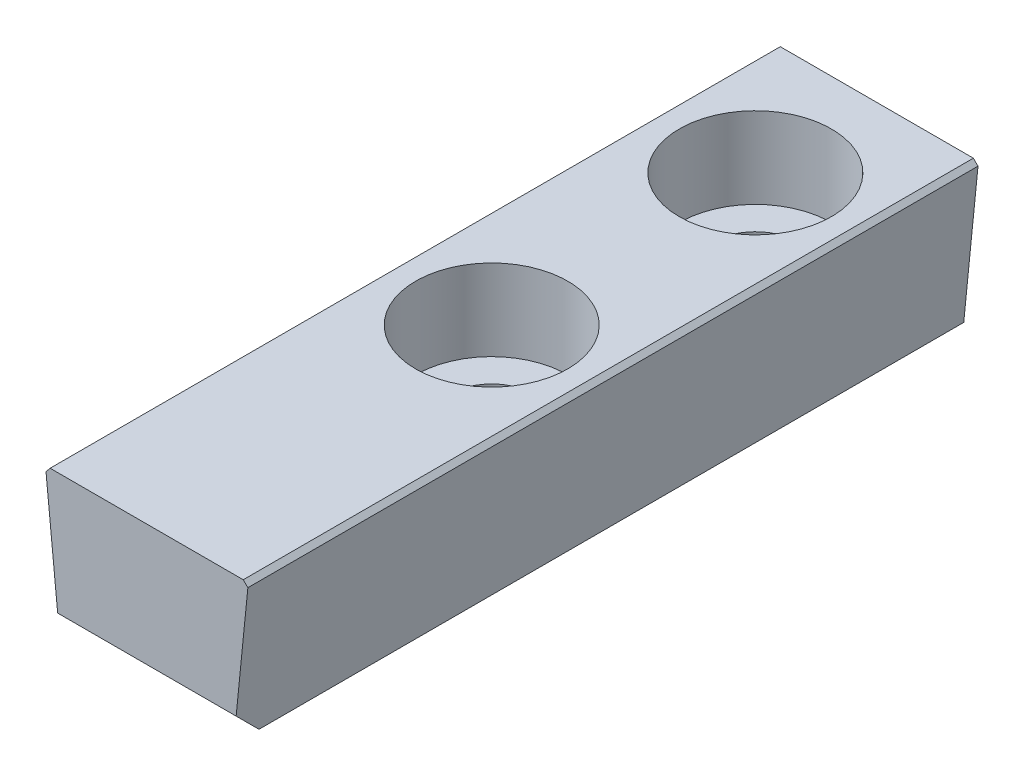
ISO-10303-21;
HEADER;
FILE_DESCRIPTION(('STEP AP214'),'2;1');
FILE_NAME('part.step','',(''),(''),'','','');
FILE_SCHEMA(('AUTOMOTIVE_DESIGN { 1 0 10303 214 1 1 1 1 }'));
ENDSEC;
DATA;
#1=APPLICATION_CONTEXT('core data for automotive mechanical design processes');
#2=APPLICATION_PROTOCOL_DEFINITION('international standard','automotive_design',2000,#1);
#3=PRODUCT_CONTEXT('',#1,'mechanical');
#4=PRODUCT('Part','Part','',(#3));
#5=PRODUCT_RELATED_PRODUCT_CATEGORY('part','',(#4));
#6=PRODUCT_DEFINITION_FORMATION('','',#4);
#7=PRODUCT_DEFINITION_CONTEXT('part definition',#1,'design');
#8=PRODUCT_DEFINITION('design','',#6,#7);
#9=PRODUCT_DEFINITION_SHAPE('','',#8);
#10=(LENGTH_UNIT() NAMED_UNIT(*) SI_UNIT(.MILLI.,.METRE.));
#11=(NAMED_UNIT(*) PLANE_ANGLE_UNIT() SI_UNIT($,.RADIAN.));
#12=(NAMED_UNIT(*) SI_UNIT($,.STERADIAN.) SOLID_ANGLE_UNIT());
#13=UNCERTAINTY_MEASURE_WITH_UNIT(LENGTH_MEASURE(1.E-05),#10,'distance_accuracy_value','');
#14=(GEOMETRIC_REPRESENTATION_CONTEXT(3) GLOBAL_UNCERTAINTY_ASSIGNED_CONTEXT((#13)) GLOBAL_UNIT_ASSIGNED_CONTEXT((#10,
#11,#12)) REPRESENTATION_CONTEXT('',''));
#15=CARTESIAN_POINT('',(0.,0.,0.));
#16=DIRECTION('',(0.,0.,1.));
#17=DIRECTION('',(1.,0.,0.));
#18=AXIS2_PLACEMENT_3D('',#15,#16,#17);
#19=CARTESIAN_POINT('',(-8.5,0.,-72.));
#20=DIRECTION('',(0.,-1.,0.));
#21=DIRECTION('',(0.,0.,-1.));
#22=AXIS2_PLACEMENT_3D('',#19,#20,#21);
#23=PLANE('',#22);
#24=DIRECTION('',(-1.,0.,0.));
#25=VECTOR('',#24,1.);
#26=CARTESIAN_POINT('',(-8.5,0.,-3.00000000000002));
#27=LINE('',#26,#25);
#28=CARTESIAN_POINT('',(7.9416735766044,0.,-3.00000000000002));
#29=VERTEX_POINT('',#28);
#30=CARTESIAN_POINT('',(-7.99999999999999,0.,-3.00000000000002));
#31=VERTEX_POINT('',#30);
#32=EDGE_CURVE('E206',#29,#31,#27,.T.);
#33=ORIENTED_EDGE('',*,*,#32,.T.);
#34=DIRECTION('',(0.,0.,-1.));
#35=VECTOR('',#34,1.);
#36=CARTESIAN_POINT('',(-7.99999999999999,0.,-72.));
#37=LINE('',#36,#35);
#38=CARTESIAN_POINT('',(-7.99999999999999,0.,-20.));
#39=VERTEX_POINT('',#38);
#40=EDGE_CURVE('E247',#31,#39,#37,.T.);
#41=ORIENTED_EDGE('',*,*,#40,.T.);
#42=DIRECTION('',(1.,0.,0.));
#43=VECTOR('',#42,1.);
#44=CARTESIAN_POINT('',(-8.5,0.,-20.));
#45=LINE('',#44,#43);
#46=CARTESIAN_POINT('',(7.9416735766044,0.,-20.));
#47=VERTEX_POINT('',#46);
#48=EDGE_CURVE('E149',#39,#47,#45,.T.);
#49=ORIENTED_EDGE('',*,*,#48,.T.);
#50=DIRECTION('',(0.,0.,-1.));
#51=VECTOR('',#50,1.);
#52=CARTESIAN_POINT('',(7.9416735766044,0.,-72.));
#53=LINE('',#52,#51);
#54=EDGE_CURVE('E245',#47,#29,#53,.F.);
#55=ORIENTED_EDGE('',*,*,#54,.T.);
#56=EDGE_LOOP('',(#33,#41,#49,#55));
#57=FACE_BOUND('',#56,.T.);
#58=ADVANCED_FACE('F41',(#57),#23,.T.);
#59=CARTESIAN_POINT('',(8.5,0.,-72.));
#60=DIRECTION('',(0.995037190209989,-0.0995037190209989,0.));
#61=DIRECTION('',(0.0995037190209989,0.995037190209989,0.));
#62=AXIS2_PLACEMENT_3D('',#59,#60,#61);
#63=PLANE('',#62);
#64=DIRECTION('',(0.0995037190209989,0.995037190209989,0.));
#65=VECTOR('',#64,1.);
#66=CARTESIAN_POINT('',(8.5,0.,-72.));
#67=LINE('',#66,#65);
#68=CARTESIAN_POINT('',(8.5497518595105,0.497518595104989,-72.));
#69=VERTEX_POINT('',#68);
#70=CARTESIAN_POINT('',(9.95454545454545,14.5454545454545,-72.));
#71=VERTEX_POINT('',#70);
#72=EDGE_CURVE('E180',#69,#71,#67,.T.);
#73=ORIENTED_EDGE('',*,*,#72,.T.);
#74=DIRECTION('',(0.,0.,1.));
#75=VECTOR('',#74,1.);
#76=CARTESIAN_POINT('',(9.95454545454545,14.5454545454545,-72.));
#77=LINE('',#76,#75);
#78=CARTESIAN_POINT('',(9.95454545454545,14.5454545454545,0.));
#79=VERTEX_POINT('',#78);
#80=EDGE_CURVE('E216',#71,#79,#77,.T.);
#81=ORIENTED_EDGE('',*,*,#80,.T.);
#82=DIRECTION('',(0.0995037190209989,0.995037190209989,0.));
#83=VECTOR('',#82,1.);
#84=CARTESIAN_POINT('',(8.5,0.,0.));
#85=LINE('',#84,#83);
#86=CARTESIAN_POINT('',(8.8,3.,0.));
#87=VERTEX_POINT('',#86);
#88=EDGE_CURVE('E179',#87,#79,#85,.T.);
#89=ORIENTED_EDGE('',*,*,#88,.F.);
#90=DIRECTION('',(0.0705345615858597,0.705345615858597,0.7053456158586));
#91=VECTOR('',#90,1.);
#92=CARTESIAN_POINT('',(5.06716417910448,-34.3283582089552,-37.3283582089554));
#93=LINE('',#92,#91);
#94=CARTESIAN_POINT('',(8.5497518595105,0.497518595104988,-2.50248140489502));
#95=VERTEX_POINT('',#94);
#96=EDGE_CURVE('E203',#87,#95,#93,.F.);
#97=ORIENTED_EDGE('',*,*,#96,.T.);
#98=DIRECTION('',(0.,0.,-1.));
#99=VECTOR('',#98,1.);
#100=CARTESIAN_POINT('',(8.5497518595105,0.497518595104989,-72.));
#101=LINE('',#100,#99);
#102=EDGE_CURVE('E214',#95,#69,#101,.T.);
#103=ORIENTED_EDGE('',*,*,#102,.T.);
#104=EDGE_LOOP('',(#73,#81,#89,#97,#103));
#105=FACE_BOUND('',#104,.T.);
#106=ADVANCED_FACE('F277',(#105),#63,.T.);
#107=CARTESIAN_POINT('',(0.,0.,-34.));
#108=DIRECTION('',(0.,1.,0.));
#109=DIRECTION('',(0.,0.,1.));
#110=AXIS2_PLACEMENT_3D('',#107,#108,#109);
#111=CIRCLE('',#110,4.20000000000001);
#112=CARTESIAN_POINT('',(0.,0.,-29.8));
#113=VERTEX_POINT('',#112);
#114=EDGE_CURVE('E316',#113,#113,#111,.T.);
#115=ORIENTED_EDGE('',*,*,#114,.T.);
#116=EDGE_LOOP('',(#115));
#117=FACE_BOUND('',#116,.T.);
#118=CARTESIAN_POINT('',(0.,0.,-60.));
#119=DIRECTION('',(0.,1.,0.));
#120=DIRECTION('',(0.,0.,1.));
#121=AXIS2_PLACEMENT_3D('',#118,#119,#120);
#122=CIRCLE('',#121,4.20000000000001);
#123=CARTESIAN_POINT('',(0.,0.,-55.8));
#124=VERTEX_POINT('',#123);
#125=EDGE_CURVE('E164',#124,#124,#122,.T.);
#126=ORIENTED_EDGE('',*,*,#125,.T.);
#127=EDGE_LOOP('',(#126));
#128=FACE_BOUND('',#127,.T.);
#129=DIRECTION('',(1.,0.,0.));
#130=VECTOR('',#129,1.);
#131=CARTESIAN_POINT('',(-8.5,0.,-22.));
#132=LINE('',#131,#130);
#133=CARTESIAN_POINT('',(-7.99999999999999,0.,-22.));
#134=VERTEX_POINT('',#133);
#135=CARTESIAN_POINT('',(7.9416735766044,0.,-22.));
#136=VERTEX_POINT('',#135);
#137=EDGE_CURVE('E211',#134,#136,#132,.T.);
#138=ORIENTED_EDGE('',*,*,#137,.F.);
#139=DIRECTION('',(0.,0.,1.));
#140=VECTOR('',#139,1.);
#141=CARTESIAN_POINT('',(-7.99999999999999,0.,-72.));
#142=LINE('',#141,#140);
#143=CARTESIAN_POINT('',(-7.99999999999999,0.,-72.));
#144=VERTEX_POINT('',#143);
#145=EDGE_CURVE('E50',#134,#144,#142,.F.);
#146=ORIENTED_EDGE('',*,*,#145,.T.);
#147=DIRECTION('',(1.,0.,0.));
#148=VECTOR('',#147,1.);
#149=CARTESIAN_POINT('',(-8.5,0.,-72.));
#150=LINE('',#149,#148);
#151=CARTESIAN_POINT('',(7.9416735766044,0.,-72.));
#152=VERTEX_POINT('',#151);
#153=EDGE_CURVE('E190',#144,#152,#150,.T.);
#154=ORIENTED_EDGE('',*,*,#153,.T.);
#155=DIRECTION('',(0.,0.,1.));
#156=VECTOR('',#155,1.);
#157=CARTESIAN_POINT('',(7.9416735766044,0.,-72.));
#158=LINE('',#157,#156);
#159=EDGE_CURVE('E252',#152,#136,#158,.T.);
#160=ORIENTED_EDGE('',*,*,#159,.T.);
#161=EDGE_LOOP('',(#138,#146,#154,#160));
#162=FACE_BOUND('',#161,.T.);
#163=ADVANCED_FACE('F256',(#117,#128,#162),#23,.T.);
#164=CARTESIAN_POINT('',(-8.5,0.,-72.));
#165=DIRECTION('',(-0.995037190209989,-0.0995037190209989,0.));
#166=DIRECTION('',(0.0995037190209989,-0.995037190209989,0.));
#167=AXIS2_PLACEMENT_3D('',#164,#165,#166);
#168=PLANE('',#167);
#169=DIRECTION('',(0.0995037190209989,-0.995037190209989,0.));
#170=VECTOR('',#169,1.);
#171=CARTESIAN_POINT('',(-8.5,0.,0.));
#172=LINE('',#171,#170);
#173=CARTESIAN_POINT('',(-9.9502481404895,14.502481404895,0.));
#174=VERTEX_POINT('',#173);
#175=CARTESIAN_POINT('',(-8.8,3.,0.));
#176=VERTEX_POINT('',#175);
#177=EDGE_CURVE('E184',#174,#176,#172,.T.);
#178=ORIENTED_EDGE('',*,*,#177,.F.);
#179=DIRECTION('',(0.,0.,-1.));
#180=VECTOR('',#179,1.);
#181=CARTESIAN_POINT('',(-9.9502481404895,14.502481404895,-72.));
#182=LINE('',#181,#180);
#183=CARTESIAN_POINT('',(-9.9502481404895,14.502481404895,-72.));
#184=VERTEX_POINT('',#183);
#185=EDGE_CURVE('E239',#174,#184,#182,.T.);
#186=ORIENTED_EDGE('',*,*,#185,.T.);
#187=DIRECTION('',(0.0995037190209989,-0.995037190209989,0.));
#188=VECTOR('',#187,1.);
#189=CARTESIAN_POINT('',(-8.5,0.,-72.));
#190=LINE('',#189,#188);
#191=CARTESIAN_POINT('',(-8.55555555555556,0.555555555555566,-72.));
#192=VERTEX_POINT('',#191);
#193=EDGE_CURVE('E187',#184,#192,#190,.T.);
#194=ORIENTED_EDGE('',*,*,#193,.T.);
#195=DIRECTION('',(0.,0.,1.));
#196=VECTOR('',#195,1.);
#197=CARTESIAN_POINT('',(-8.55555555555556,0.555555555555566,-72.));
#198=LINE('',#197,#196);
#199=CARTESIAN_POINT('',(-8.55555555555556,0.555555555555566,-2.44444444444444));
#200=VERTEX_POINT('',#199);
#201=EDGE_CURVE('E236',#192,#200,#198,.T.);
#202=ORIENTED_EDGE('',*,*,#201,.T.);
#203=DIRECTION('',(0.0705345615858597,-0.705345615858597,-0.7053456158586));
#204=VECTOR('',#203,1.);
#205=CARTESIAN_POINT('',(-5.06716417910448,-34.3283582089552,-37.3283582089554));
#206=LINE('',#205,#204);
#207=EDGE_CURVE('E209',#200,#176,#206,.F.);
#208=ORIENTED_EDGE('',*,*,#207,.T.);
#209=EDGE_LOOP('',(#178,#186,#194,#202,#208));
#210=FACE_BOUND('',#209,.T.);
#211=ADVANCED_FACE('F268',(#210),#168,.T.);
#212=CARTESIAN_POINT('',(10.,15.,-72.));
#213=DIRECTION('',(0.,1.,0.));
#214=DIRECTION('',(0.,0.,1.));
#215=AXIS2_PLACEMENT_3D('',#212,#213,#214);
#216=PLANE('',#215);
#217=CARTESIAN_POINT('',(0.,15.,-34.));
#218=DIRECTION('',(0.,1.,0.));
#219=DIRECTION('',(0.,0.,1.));
#220=AXIS2_PLACEMENT_3D('',#217,#218,#219);
#221=CIRCLE('',#220,7.50000000000001);
#222=CARTESIAN_POINT('',(0.,15.,-26.5));
#223=VERTEX_POINT('',#222);
#224=EDGE_CURVE('E337',#223,#223,#221,.T.);
#225=ORIENTED_EDGE('',*,*,#224,.F.);
#226=EDGE_LOOP('',(#225));
#227=FACE_BOUND('',#226,.T.);
#228=CARTESIAN_POINT('',(0.,15.,-60.));
#229=DIRECTION('',(0.,1.,0.));
#230=DIRECTION('',(0.,0.,1.));
#231=AXIS2_PLACEMENT_3D('',#228,#229,#230);
#232=CIRCLE('',#231,7.50000000000001);
#233=CARTESIAN_POINT('',(0.,15.,-52.5));
#234=VERTEX_POINT('',#233);
#235=EDGE_CURVE('E327',#234,#234,#232,.T.);
#236=ORIENTED_EDGE('',*,*,#235,.F.);
#237=EDGE_LOOP('',(#236));
#238=FACE_BOUND('',#237,.T.);
#239=DIRECTION('',(-1.,0.,0.));
#240=VECTOR('',#239,1.);
#241=CARTESIAN_POINT('',(10.,15.,0.));
#242=LINE('',#241,#240);
#243=CARTESIAN_POINT('',(9.49999999999998,15.,0.));
#244=VERTEX_POINT('',#243);
#245=CARTESIAN_POINT('',(-9.54318747176724,15.,0.));
#246=VERTEX_POINT('',#245);
#247=EDGE_CURVE('E196',#244,#246,#242,.T.);
#248=ORIENTED_EDGE('',*,*,#247,.F.);
#249=DIRECTION('',(0.,0.,-1.));
#250=VECTOR('',#249,1.);
#251=CARTESIAN_POINT('',(9.49999999999998,15.,-72.));
#252=LINE('',#251,#250);
#253=CARTESIAN_POINT('',(9.49999999999998,15.,-72.));
#254=VERTEX_POINT('',#253);
#255=EDGE_CURVE('E226',#244,#254,#252,.T.);
#256=ORIENTED_EDGE('',*,*,#255,.T.);
#257=DIRECTION('',(-1.,0.,0.));
#258=VECTOR('',#257,1.);
#259=CARTESIAN_POINT('',(10.,15.,-72.));
#260=LINE('',#259,#258);
#261=CARTESIAN_POINT('',(-9.54318747176724,15.,-72.));
#262=VERTEX_POINT('',#261);
#263=EDGE_CURVE('E183',#254,#262,#260,.T.);
#264=ORIENTED_EDGE('',*,*,#263,.T.);
#265=DIRECTION('',(0.,0.,1.));
#266=VECTOR('',#265,1.);
#267=CARTESIAN_POINT('',(-9.54318747176724,15.,-72.));
#268=LINE('',#267,#266);
#269=EDGE_CURVE('E223',#262,#246,#268,.T.);
#270=ORIENTED_EDGE('',*,*,#269,.T.);
#271=EDGE_LOOP('',(#248,#256,#264,#270));
#272=FACE_BOUND('',#271,.T.);
#273=ADVANCED_FACE('F286',(#227,#238,#272),#216,.T.);
#274=CARTESIAN_POINT('',(0.,0.,-72.));
#275=DIRECTION('',(0.,0.,1.));
#276=DIRECTION('',(1.,0.,0.));
#277=AXIS2_PLACEMENT_3D('',#274,#275,#276);
#278=PLANE('',#277);
#279=ORIENTED_EDGE('',*,*,#263,.F.);
#280=DIRECTION('',(-0.707106781186548,0.707106781186548,0.));
#281=VECTOR('',#280,1.);
#282=CARTESIAN_POINT('',(9.95454545454545,14.5454545454545,-72.));
#283=LINE('',#282,#281);
#284=EDGE_CURVE('E234',#254,#71,#283,.F.);
#285=ORIENTED_EDGE('',*,*,#284,.T.);
#286=ORIENTED_EDGE('',*,*,#72,.F.);
#287=DIRECTION('',(0.773957299203322,0.633237790257261,0.));
#288=VECTOR('',#287,1.);
#289=CARTESIAN_POINT('',(7.9416735766044,0.,-72.));
#290=LINE('',#289,#288);
#291=EDGE_CURVE('E228',#69,#152,#290,.F.);
#292=ORIENTED_EDGE('',*,*,#291,.T.);
#293=ORIENTED_EDGE('',*,*,#153,.F.);
#294=DIRECTION('',(0.707106781186548,-0.707106781186548,0.));
#295=VECTOR('',#294,1.);
#296=CARTESIAN_POINT('',(-8.55555555555556,0.555555555555566,-72.));
#297=LINE('',#296,#295);
#298=EDGE_CURVE('E230',#144,#192,#297,.F.);
#299=ORIENTED_EDGE('',*,*,#298,.T.);
#300=ORIENTED_EDGE('',*,*,#193,.F.);
#301=DIRECTION('',(-0.633237790257265,-0.773957299203319,0.));
#302=VECTOR('',#301,1.);
#303=CARTESIAN_POINT('',(-9.54318747176724,15.,-72.));
#304=LINE('',#303,#302);
#305=EDGE_CURVE('E232',#184,#262,#304,.F.);
#306=ORIENTED_EDGE('',*,*,#305,.T.);
#307=EDGE_LOOP('',(#279,#285,#286,#292,#293,#299,#300,#306));
#308=FACE_BOUND('',#307,.T.);
#309=ADVANCED_FACE('F260',(#308),#278,.F.);
#310=CARTESIAN_POINT('',(0.,0.,0.));
#311=DIRECTION('',(0.,0.,1.));
#312=DIRECTION('',(1.,0.,0.));
#313=AXIS2_PLACEMENT_3D('',#310,#311,#312);
#314=PLANE('',#313);
#315=ORIENTED_EDGE('',*,*,#88,.T.);
#316=DIRECTION('',(0.707106781186548,-0.707106781186548,0.));
#317=VECTOR('',#316,1.);
#318=CARTESIAN_POINT('',(12.25,12.25,0.));
#319=LINE('',#318,#317);
#320=EDGE_CURVE('E221',#79,#244,#319,.F.);
#321=ORIENTED_EDGE('',*,*,#320,.T.);
#322=ORIENTED_EDGE('',*,*,#247,.T.);
#323=DIRECTION('',(0.633237790257265,0.773957299203319,0.));
#324=VECTOR('',#323,1.);
#325=CARTESIAN_POINT('',(-13.0679489311081,10.6919582163612,0.));
#326=LINE('',#325,#324);
#327=EDGE_CURVE('E219',#246,#174,#326,.F.);
#328=ORIENTED_EDGE('',*,*,#327,.T.);
#329=ORIENTED_EDGE('',*,*,#177,.T.);
#330=DIRECTION('',(1.,0.,0.));
#331=VECTOR('',#330,1.);
#332=CARTESIAN_POINT('',(0.,3.,0.));
#333=LINE('',#332,#331);
#334=EDGE_CURVE('E193',#176,#87,#333,.T.);
#335=ORIENTED_EDGE('',*,*,#334,.T.);
#336=EDGE_LOOP('',(#315,#321,#322,#328,#329,#335));
#337=FACE_BOUND('',#336,.T.);
#338=ADVANCED_FACE('F275',(#337),#314,.T.);
#339=CARTESIAN_POINT('',(0.,3.,0.));
#340=DIRECTION('',(0.,0.707106781186549,-0.707106781186546));
#341=DIRECTION('',(1.,0.,0.));
#342=AXIS2_PLACEMENT_3D('',#339,#340,#341);
#343=PLANE('',#342);
#344=ORIENTED_EDGE('',*,*,#207,.F.);
#345=DIRECTION('',(0.577350269189625,-0.577350269189625,-0.577350269189628));
#346=VECTOR('',#345,1.);
#347=CARTESIAN_POINT('',(-7.33333333333334,-0.666666666666651,-3.66666666666667));
#348=LINE('',#347,#346);
#349=EDGE_CURVE('E243',#200,#31,#348,.T.);
#350=ORIENTED_EDGE('',*,*,#349,.T.);
#351=ORIENTED_EDGE('',*,*,#32,.F.);
#352=DIRECTION('',(0.653882128105541,0.534994468449986,0.534994468449989));
#353=VECTOR('',#352,1.);
#354=CARTESIAN_POINT('',(6.64505695904563,-1.06086814163899,-4.06086814163901));
#355=LINE('',#354,#353);
#356=EDGE_CURVE('E241',#29,#95,#355,.T.);
#357=ORIENTED_EDGE('',*,*,#356,.T.);
#358=ORIENTED_EDGE('',*,*,#96,.F.);
#359=ORIENTED_EDGE('',*,*,#334,.F.);
#360=EDGE_LOOP('',(#344,#350,#351,#357,#358,#359));
#361=FACE_BOUND('',#360,.T.);
#362=ADVANCED_FACE('F271',(#361),#343,.F.);
#363=CARTESIAN_POINT('',(8.5,-1.2E-05,-20.));
#364=DIRECTION('',(0.,0.,-1.));
#365=DIRECTION('',(-1.,0.,0.));
#366=AXIS2_PLACEMENT_3D('',#363,#364,#365);
#367=PLANE('',#366);
#368=ORIENTED_EDGE('',*,*,#48,.F.);
#369=DIRECTION('',(0.707106781186548,-0.707106781186548,0.));
#370=VECTOR('',#369,1.);
#371=CARTESIAN_POINT('',(0.250006000000004,-8.250006,-20.));
#372=LINE('',#371,#370);
#373=CARTESIAN_POINT('',(-8.5,0.5,-20.));
#374=VERTEX_POINT('',#373);
#375=EDGE_CURVE('E143',#39,#374,#372,.F.);
#376=ORIENTED_EDGE('',*,*,#375,.T.);
#377=DIRECTION('',(1.,0.,0.));
#378=VECTOR('',#377,1.);
#379=CARTESIAN_POINT('',(8.5,0.5,-20.));
#380=LINE('',#379,#378);
#381=CARTESIAN_POINT('',(8.5,0.5,-20.));
#382=VERTEX_POINT('',#381);
#383=EDGE_CURVE('E147',#382,#374,#380,.F.);
#384=ORIENTED_EDGE('',*,*,#383,.F.);
#385=DIRECTION('',(0.,1.,0.));
#386=VECTOR('',#385,1.);
#387=CARTESIAN_POINT('',(8.5,-1.2E-05,-20.));
#388=LINE('',#387,#386);
#389=CARTESIAN_POINT('',(8.5,0.456812528232763,-20.));
#390=VERTEX_POINT('',#389);
#391=EDGE_CURVE('E175',#390,#382,#388,.T.);
#392=ORIENTED_EDGE('',*,*,#391,.F.);
#393=DIRECTION('',(0.773957299203322,0.633237790257261,0.));
#394=VECTOR('',#393,1.);
#395=CARTESIAN_POINT('',(8.27611075101464,0.273630415426557,-20.));
#396=LINE('',#395,#394);
#397=EDGE_CURVE('E153',#390,#47,#396,.F.);
#398=ORIENTED_EDGE('',*,*,#397,.T.);
#399=EDGE_LOOP('',(#368,#376,#384,#392,#398));
#400=FACE_BOUND('',#399,.T.);
#401=ADVANCED_FACE('F145',(#400),#367,.T.);
#402=CARTESIAN_POINT('',(8.5,-1.2E-05,-22.));
#403=DIRECTION('',(0.,0.,-1.));
#404=DIRECTION('',(-1.,0.,0.));
#405=AXIS2_PLACEMENT_3D('',#402,#403,#404);
#406=PLANE('',#405);
#407=DIRECTION('',(-1.,0.,0.));
#408=VECTOR('',#407,1.);
#409=CARTESIAN_POINT('',(8.5,0.5,-22.));
#410=LINE('',#409,#408);
#411=CARTESIAN_POINT('',(8.5,0.5,-22.));
#412=VERTEX_POINT('',#411);
#413=CARTESIAN_POINT('',(-8.5,0.5,-22.));
#414=VERTEX_POINT('',#413);
#415=EDGE_CURVE('E169',#412,#414,#410,.T.);
#416=ORIENTED_EDGE('',*,*,#415,.T.);
#417=DIRECTION('',(-0.707106781186548,0.707106781186548,0.));
#418=VECTOR('',#417,1.);
#419=CARTESIAN_POINT('',(-8.55555555555556,0.555555555555566,-22.));
#420=LINE('',#419,#418);
#421=EDGE_CURVE('E168',#414,#134,#420,.F.);
#422=ORIENTED_EDGE('',*,*,#421,.T.);
#423=ORIENTED_EDGE('',*,*,#137,.T.);
#424=DIRECTION('',(-0.773957299203322,-0.633237790257261,0.));
#425=VECTOR('',#424,1.);
#426=CARTESIAN_POINT('',(7.9416735766044,0.,-22.));
#427=LINE('',#426,#425);
#428=CARTESIAN_POINT('',(8.5,0.456812528232763,-22.));
#429=VERTEX_POINT('',#428);
#430=EDGE_CURVE('E57',#136,#429,#427,.F.);
#431=ORIENTED_EDGE('',*,*,#430,.T.);
#432=DIRECTION('',(0.,1.,0.));
#433=VECTOR('',#432,1.);
#434=CARTESIAN_POINT('',(8.5,-1.2E-05,-22.));
#435=LINE('',#434,#433);
#436=EDGE_CURVE('E177',#429,#412,#435,.T.);
#437=ORIENTED_EDGE('',*,*,#436,.T.);
#438=EDGE_LOOP('',(#416,#422,#423,#431,#437));
#439=FACE_BOUND('',#438,.T.);
#440=ADVANCED_FACE('F293',(#439),#406,.F.);
#441=CARTESIAN_POINT('',(8.5,-1.2E-05,-20.));
#442=DIRECTION('',(1.,0.,0.));
#443=DIRECTION('',(0.,0.,-1.));
#444=AXIS2_PLACEMENT_3D('',#441,#442,#443);
#445=PLANE('',#444);
#446=ORIENTED_EDGE('',*,*,#436,.F.);
#447=DIRECTION('',(0.,0.,-1.));
#448=VECTOR('',#447,1.);
#449=CARTESIAN_POINT('',(8.5,0.456812528232763,-72.));
#450=LINE('',#449,#448);
#451=EDGE_CURVE('E11',#429,#390,#450,.F.);
#452=ORIENTED_EDGE('',*,*,#451,.T.);
#453=ORIENTED_EDGE('',*,*,#391,.T.);
#454=DIRECTION('',(0.,0.,-1.));
#455=VECTOR('',#454,1.);
#456=CARTESIAN_POINT('',(8.5,0.5,-20.));
#457=LINE('',#456,#455);
#458=EDGE_CURVE('E163',#382,#412,#457,.T.);
#459=ORIENTED_EDGE('',*,*,#458,.T.);
#460=EDGE_LOOP('',(#446,#452,#453,#459));
#461=FACE_BOUND('',#460,.T.);
#462=ADVANCED_FACE('F295',(#461),#445,.F.);
#463=CARTESIAN_POINT('',(0.,0.5,0.));
#464=DIRECTION('',(0.,-1.,0.));
#465=DIRECTION('',(1.,0.,0.));
#466=AXIS2_PLACEMENT_3D('',#463,#464,#465);
#467=PLANE('',#466);
#468=ORIENTED_EDGE('',*,*,#383,.T.);
#469=DIRECTION('',(0.,0.,1.));
#470=VECTOR('',#469,1.);
#471=CARTESIAN_POINT('',(-8.5,0.5,-22.));
#472=LINE('',#471,#470);
#473=EDGE_CURVE('E160',#414,#374,#472,.T.);
#474=ORIENTED_EDGE('',*,*,#473,.F.);
#475=ORIENTED_EDGE('',*,*,#415,.F.);
#476=ORIENTED_EDGE('',*,*,#458,.F.);
#477=EDGE_LOOP('',(#468,#474,#475,#476));
#478=FACE_BOUND('',#477,.T.);
#479=ADVANCED_FACE('F158',(#478),#467,.T.);
#480=CARTESIAN_POINT('',(0.,15.,-60.));
#481=DIRECTION('',(0.,1.,0.));
#482=DIRECTION('',(0.,0.,1.));
#483=AXIS2_PLACEMENT_3D('',#480,#481,#482);
#484=CYLINDRICAL_SURFACE('',#483,4.20000000000001);
#485=ORIENTED_EDGE('',*,*,#125,.F.);
#486=EDGE_LOOP('',(#485));
#487=FACE_BOUND('',#486,.T.);
#488=CARTESIAN_POINT('',(0.,7.,-60.));
#489=DIRECTION('',(0.,1.,0.));
#490=DIRECTION('',(0.,0.,1.));
#491=AXIS2_PLACEMENT_3D('',#488,#489,#490);
#492=CIRCLE('',#491,4.20000000000001);
#493=CARTESIAN_POINT('',(0.,7.,-55.8));
#494=VERTEX_POINT('',#493);
#495=EDGE_CURVE('E320',#494,#494,#492,.T.);
#496=ORIENTED_EDGE('',*,*,#495,.T.);
#497=EDGE_LOOP('',(#496));
#498=FACE_BOUND('',#497,.T.);
#499=ADVANCED_FACE('F361',(#487,#498),#484,.F.);
#500=CARTESIAN_POINT('',(4.20000000000001,7.,-60.));
#501=DIRECTION('',(0.,-1.,0.));
#502=DIRECTION('',(0.,0.,-1.));
#503=AXIS2_PLACEMENT_3D('',#500,#501,#502);
#504=PLANE('',#503);
#505=ORIENTED_EDGE('',*,*,#495,.F.);
#506=EDGE_LOOP('',(#505));
#507=FACE_BOUND('',#506,.T.);
#508=CARTESIAN_POINT('',(0.,7.,-60.));
#509=DIRECTION('',(0.,1.,0.));
#510=DIRECTION('',(0.,0.,1.));
#511=AXIS2_PLACEMENT_3D('',#508,#509,#510);
#512=CIRCLE('',#511,7.50000000000001);
#513=CARTESIAN_POINT('',(0.,7.,-52.5));
#514=VERTEX_POINT('',#513);
#515=EDGE_CURVE('E322',#514,#514,#512,.T.);
#516=ORIENTED_EDGE('',*,*,#515,.T.);
#517=EDGE_LOOP('',(#516));
#518=FACE_BOUND('',#517,.T.);
#519=ADVANCED_FACE('F351',(#507,#518),#504,.F.);
#520=CARTESIAN_POINT('',(0.,15.,-60.));
#521=DIRECTION('',(0.,1.,0.));
#522=DIRECTION('',(0.,0.,1.));
#523=AXIS2_PLACEMENT_3D('',#520,#521,#522);
#524=CYLINDRICAL_SURFACE('',#523,7.50000000000001);
#525=ORIENTED_EDGE('',*,*,#515,.F.);
#526=EDGE_LOOP('',(#525));
#527=FACE_BOUND('',#526,.T.);
#528=ORIENTED_EDGE('',*,*,#235,.T.);
#529=EDGE_LOOP('',(#528));
#530=FACE_BOUND('',#529,.T.);
#531=ADVANCED_FACE('F348',(#527,#530),#524,.F.);
#532=CARTESIAN_POINT('',(0.,15.,-34.));
#533=DIRECTION('',(0.,1.,0.));
#534=DIRECTION('',(0.,0.,1.));
#535=AXIS2_PLACEMENT_3D('',#532,#533,#534);
#536=CYLINDRICAL_SURFACE('',#535,4.20000000000001);
#537=ORIENTED_EDGE('',*,*,#114,.F.);
#538=EDGE_LOOP('',(#537));
#539=FACE_BOUND('',#538,.T.);
#540=CARTESIAN_POINT('',(0.,7.,-34.));
#541=DIRECTION('',(0.,1.,0.));
#542=DIRECTION('',(0.,0.,1.));
#543=AXIS2_PLACEMENT_3D('',#540,#541,#542);
#544=CIRCLE('',#543,4.20000000000001);
#545=CARTESIAN_POINT('',(0.,7.,-29.8));
#546=VERTEX_POINT('',#545);
#547=EDGE_CURVE('E331',#546,#546,#544,.T.);
#548=ORIENTED_EDGE('',*,*,#547,.T.);
#549=EDGE_LOOP('',(#548));
#550=FACE_BOUND('',#549,.T.);
#551=ADVANCED_FACE('F350',(#539,#550),#536,.F.);
#552=CARTESIAN_POINT('',(4.20000000000001,7.,-34.));
#553=DIRECTION('',(0.,-1.,0.));
#554=DIRECTION('',(0.,0.,-1.));
#555=AXIS2_PLACEMENT_3D('',#552,#553,#554);
#556=PLANE('',#555);
#557=ORIENTED_EDGE('',*,*,#547,.F.);
#558=EDGE_LOOP('',(#557));
#559=FACE_BOUND('',#558,.T.);
#560=CARTESIAN_POINT('',(0.,7.,-34.));
#561=DIRECTION('',(0.,1.,0.));
#562=DIRECTION('',(0.,0.,1.));
#563=AXIS2_PLACEMENT_3D('',#560,#561,#562);
#564=CIRCLE('',#563,7.50000000000001);
#565=CARTESIAN_POINT('',(0.,7.,-26.5));
#566=VERTEX_POINT('',#565);
#567=EDGE_CURVE('E334',#566,#566,#564,.T.);
#568=ORIENTED_EDGE('',*,*,#567,.T.);
#569=EDGE_LOOP('',(#568));
#570=FACE_BOUND('',#569,.T.);
#571=ADVANCED_FACE('F358',(#559,#570),#556,.F.);
#572=CARTESIAN_POINT('',(0.,15.,-34.));
#573=DIRECTION('',(0.,1.,0.));
#574=DIRECTION('',(0.,0.,1.));
#575=AXIS2_PLACEMENT_3D('',#572,#573,#574);
#576=CYLINDRICAL_SURFACE('',#575,7.50000000000001);
#577=ORIENTED_EDGE('',*,*,#567,.F.);
#578=EDGE_LOOP('',(#577));
#579=FACE_BOUND('',#578,.T.);
#580=ORIENTED_EDGE('',*,*,#224,.T.);
#581=EDGE_LOOP('',(#580));
#582=FACE_BOUND('',#581,.T.);
#583=ADVANCED_FACE('F341',(#579,#582),#576,.F.);
#584=CARTESIAN_POINT('',(9.95454545454545,14.5454545454545,-72.));
#585=DIRECTION('',(-0.707106781186547,-0.707106781186547,0.));
#586=DIRECTION('',(0.,0.,1.));
#587=AXIS2_PLACEMENT_3D('',#584,#585,#586);
#588=PLANE('',#587);
#589=ORIENTED_EDGE('',*,*,#284,.F.);
#590=ORIENTED_EDGE('',*,*,#255,.F.);
#591=ORIENTED_EDGE('',*,*,#320,.F.);
#592=ORIENTED_EDGE('',*,*,#80,.F.);
#593=EDGE_LOOP('',(#589,#590,#591,#592));
#594=FACE_BOUND('',#593,.T.);
#595=ADVANCED_FACE('F282',(#594),#588,.F.);
#596=CARTESIAN_POINT('',(-9.54318747176724,15.,-72.));
#597=DIRECTION('',(0.773957299203319,-0.633237790257265,0.));
#598=DIRECTION('',(0.,0.,1.));
#599=AXIS2_PLACEMENT_3D('',#596,#597,#598);
#600=PLANE('',#599);
#601=ORIENTED_EDGE('',*,*,#305,.F.);
#602=ORIENTED_EDGE('',*,*,#185,.F.);
#603=ORIENTED_EDGE('',*,*,#327,.F.);
#604=ORIENTED_EDGE('',*,*,#269,.F.);
#605=EDGE_LOOP('',(#601,#602,#603,#604));
#606=FACE_BOUND('',#605,.T.);
#607=ADVANCED_FACE('F290',(#606),#600,.F.);
#608=CARTESIAN_POINT('',(-8.55555555555556,0.555555555555566,-72.));
#609=DIRECTION('',(0.707106781186548,0.707106781186548,0.));
#610=DIRECTION('',(0.,0.,1.));
#611=AXIS2_PLACEMENT_3D('',#608,#609,#610);
#612=PLANE('',#611);
#613=ORIENTED_EDGE('',*,*,#375,.F.);
#614=ORIENTED_EDGE('',*,*,#40,.F.);
#615=ORIENTED_EDGE('',*,*,#349,.F.);
#616=ORIENTED_EDGE('',*,*,#201,.F.);
#617=ORIENTED_EDGE('',*,*,#298,.F.);
#618=ORIENTED_EDGE('',*,*,#145,.F.);
#619=ORIENTED_EDGE('',*,*,#421,.F.);
#620=ORIENTED_EDGE('',*,*,#473,.T.);
#621=EDGE_LOOP('',(#613,#614,#615,#616,#617,#618,#619,#620));
#622=FACE_BOUND('',#621,.T.);
#623=ADVANCED_FACE('F166',(#622),#612,.F.);
#624=CARTESIAN_POINT('',(7.9416735766044,0.,-72.));
#625=DIRECTION('',(-0.633237790257261,0.773957299203322,0.));
#626=DIRECTION('',(0.,0.,1.));
#627=AXIS2_PLACEMENT_3D('',#624,#625,#626);
#628=PLANE('',#627);
#629=ORIENTED_EDGE('',*,*,#291,.F.);
#630=ORIENTED_EDGE('',*,*,#102,.F.);
#631=ORIENTED_EDGE('',*,*,#356,.F.);
#632=ORIENTED_EDGE('',*,*,#54,.F.);
#633=ORIENTED_EDGE('',*,*,#397,.F.);
#634=ORIENTED_EDGE('',*,*,#451,.F.);
#635=ORIENTED_EDGE('',*,*,#430,.F.);
#636=ORIENTED_EDGE('',*,*,#159,.F.);
#637=EDGE_LOOP('',(#629,#630,#631,#632,#633,#634,#635,#636));
#638=FACE_BOUND('',#637,.T.);
#639=ADVANCED_FACE('F44',(#638),#628,.F.);
#640=CLOSED_SHELL('',(#58,#106,#163,#211,#273,#309,#338,#362,#401,#440,#462,#479,#499,#519,#531,
#551,#571,#583,#595,#607,#623,#639));
#641=MANIFOLD_SOLID_BREP('B2',#640);
#642=ADVANCED_BREP_SHAPE_REPRESENTATION('',(#18,#641),#14);
#643=SHAPE_DEFINITION_REPRESENTATION(#9,#642);
ENDSEC;
END-ISO-10303-21;
